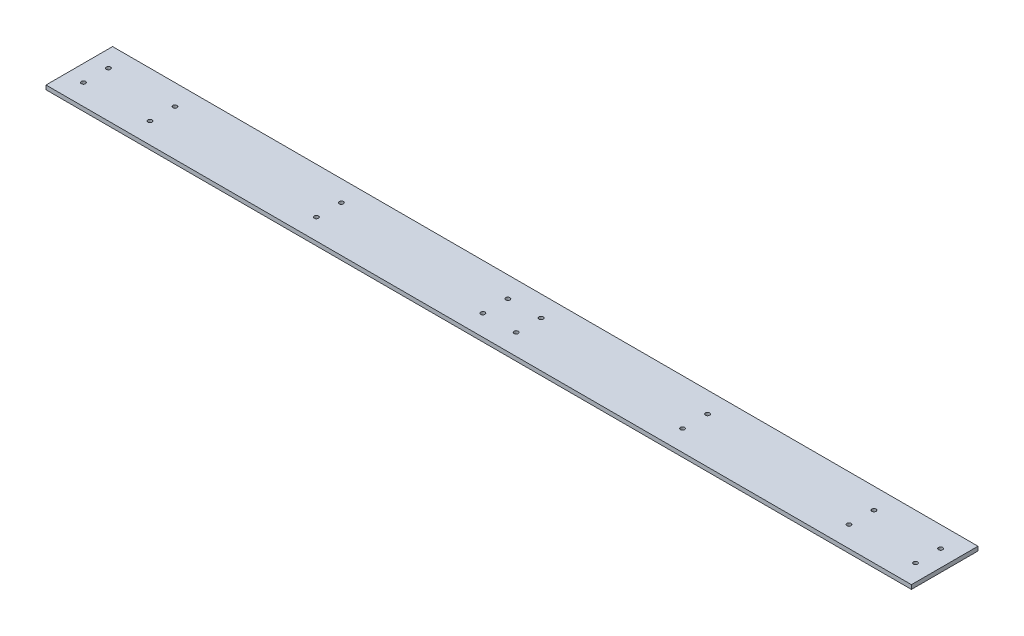
ISO-10303-21;
HEADER;
FILE_DESCRIPTION(('STEP AP214'),'2;1');
FILE_NAME('part.step','',(''),(''),'','','');
FILE_SCHEMA(('AUTOMOTIVE_DESIGN { 1 0 10303 214 1 1 1 1 }'));
ENDSEC;
DATA;
#1=APPLICATION_CONTEXT('core data for automotive mechanical design processes');
#2=APPLICATION_PROTOCOL_DEFINITION('international standard','automotive_design',2000,#1);
#3=PRODUCT_CONTEXT('',#1,'mechanical');
#4=PRODUCT('Part','Part','',(#3));
#5=PRODUCT_RELATED_PRODUCT_CATEGORY('part','',(#4));
#6=PRODUCT_DEFINITION_FORMATION('','',#4);
#7=PRODUCT_DEFINITION_CONTEXT('part definition',#1,'design');
#8=PRODUCT_DEFINITION('design','',#6,#7);
#9=PRODUCT_DEFINITION_SHAPE('','',#8);
#10=(LENGTH_UNIT() NAMED_UNIT(*) SI_UNIT(.MILLI.,.METRE.));
#11=(NAMED_UNIT(*) PLANE_ANGLE_UNIT() SI_UNIT($,.RADIAN.));
#12=(NAMED_UNIT(*) SI_UNIT($,.STERADIAN.) SOLID_ANGLE_UNIT());
#13=UNCERTAINTY_MEASURE_WITH_UNIT(LENGTH_MEASURE(1.E-05),#10,'distance_accuracy_value','');
#14=(GEOMETRIC_REPRESENTATION_CONTEXT(3) GLOBAL_UNCERTAINTY_ASSIGNED_CONTEXT((#13)) GLOBAL_UNIT_ASSIGNED_CONTEXT((#10,
#11,#12)) REPRESENTATION_CONTEXT('',''));
#15=CARTESIAN_POINT('',(0.,0.,0.));
#16=DIRECTION('',(0.,0.,1.));
#17=DIRECTION('',(1.,0.,0.));
#18=AXIS2_PLACEMENT_3D('',#15,#16,#17);
#19=CARTESIAN_POINT('',(0.,5.,0.));
#20=DIRECTION('',(0.,1.,0.));
#21=DIRECTION('',(0.,0.,1.));
#22=AXIS2_PLACEMENT_3D('',#19,#20,#21);
#23=PLANE('',#22);
#24=CARTESIAN_POINT('',(-480.,5.,-15.));
#25=DIRECTION('',(0.,1.,0.));
#26=DIRECTION('',(0.,0.,1.));
#27=AXIS2_PLACEMENT_3D('',#24,#25,#26);
#28=CIRCLE('',#27,2.50000000000002);
#29=CARTESIAN_POINT('',(-480.,5.,-12.5));
#30=VERTEX_POINT('',#29);
#31=EDGE_CURVE('E195',#30,#30,#28,.T.);
#32=ORIENTED_EDGE('',*,*,#31,.F.);
#33=EDGE_LOOP('',(#32));
#34=FACE_BOUND('',#33,.T.);
#35=CARTESIAN_POINT('',(520.,5.,-15.));
#36=DIRECTION('',(0.,1.,0.));
#37=DIRECTION('',(0.,0.,1.));
#38=AXIS2_PLACEMENT_3D('',#35,#36,#37);
#39=CIRCLE('',#38,2.49999999999991);
#40=CARTESIAN_POINT('',(520.,5.,-12.5000000000001));
#41=VERTEX_POINT('',#40);
#42=EDGE_CURVE('E183',#41,#41,#39,.T.);
#43=ORIENTED_EDGE('',*,*,#42,.F.);
#44=EDGE_LOOP('',(#43));
#45=FACE_BOUND('',#44,.T.);
#46=CARTESIAN_POINT('',(440.,5.,-15.));
#47=DIRECTION('',(0.,1.,0.));
#48=DIRECTION('',(0.,0.,1.));
#49=AXIS2_PLACEMENT_3D('',#46,#47,#48);
#50=CIRCLE('',#49,2.50000000000002);
#51=CARTESIAN_POINT('',(440.,5.,-12.5));
#52=VERTEX_POINT('',#51);
#53=EDGE_CURVE('E171',#52,#52,#50,.T.);
#54=ORIENTED_EDGE('',*,*,#53,.F.);
#55=EDGE_LOOP('',(#54));
#56=FACE_BOUND('',#55,.T.);
#57=CARTESIAN_POINT('',(-400.,5.,-14.9999999999917));
#58=DIRECTION('',(0.,1.,0.));
#59=DIRECTION('',(0.,0.,1.));
#60=AXIS2_PLACEMENT_3D('',#57,#58,#59);
#61=CIRCLE('',#60,2.50000000000002);
#62=CARTESIAN_POINT('',(-400.,5.,-12.4999999999917));
#63=VERTEX_POINT('',#62);
#64=EDGE_CURVE('E159',#63,#63,#61,.T.);
#65=ORIENTED_EDGE('',*,*,#64,.F.);
#66=EDGE_LOOP('',(#65));
#67=FACE_BOUND('',#66,.T.);
#68=CARTESIAN_POINT('',(240.,5.,-15.));
#69=DIRECTION('',(0.,1.,0.));
#70=DIRECTION('',(0.,0.,1.));
#71=AXIS2_PLACEMENT_3D('',#68,#69,#70);
#72=CIRCLE('',#71,2.5);
#73=CARTESIAN_POINT('',(240.,5.,-12.5));
#74=VERTEX_POINT('',#73);
#75=EDGE_CURVE('E147',#74,#74,#72,.T.);
#76=ORIENTED_EDGE('',*,*,#75,.F.);
#77=EDGE_LOOP('',(#76));
#78=FACE_BOUND('',#77,.T.);
#79=CARTESIAN_POINT('',(-200.,5.,-14.9999999999959));
#80=DIRECTION('',(0.,1.,0.));
#81=DIRECTION('',(0.,0.,1.));
#82=AXIS2_PLACEMENT_3D('',#79,#80,#81);
#83=CIRCLE('',#82,2.5);
#84=CARTESIAN_POINT('',(-200.,5.,-12.4999999999959));
#85=VERTEX_POINT('',#84);
#86=EDGE_CURVE('E135',#85,#85,#83,.T.);
#87=ORIENTED_EDGE('',*,*,#86,.F.);
#88=EDGE_LOOP('',(#87));
#89=FACE_BOUND('',#88,.T.);
#90=CARTESIAN_POINT('',(40.,5.,-15.));
#91=DIRECTION('',(0.,1.,0.));
#92=DIRECTION('',(0.,0.,1.));
#93=AXIS2_PLACEMENT_3D('',#90,#91,#92);
#94=CIRCLE('',#93,2.5);
#95=CARTESIAN_POINT('',(40.,5.,-12.5));
#96=VERTEX_POINT('',#95);
#97=EDGE_CURVE('E123',#96,#96,#94,.T.);
#98=ORIENTED_EDGE('',*,*,#97,.F.);
#99=EDGE_LOOP('',(#98));
#100=FACE_BOUND('',#99,.T.);
#101=CARTESIAN_POINT('',(0.,5.,-15.));
#102=DIRECTION('',(0.,1.,0.));
#103=DIRECTION('',(0.,0.,1.));
#104=AXIS2_PLACEMENT_3D('',#101,#102,#103);
#105=CIRCLE('',#104,2.5);
#106=CARTESIAN_POINT('',(0.,5.,-12.5));
#107=VERTEX_POINT('',#106);
#108=EDGE_CURVE('E102',#107,#107,#105,.T.);
#109=ORIENTED_EDGE('',*,*,#108,.F.);
#110=EDGE_LOOP('',(#109));
#111=FACE_BOUND('',#110,.T.);
#112=DIRECTION('',(0.,0.,1.));
#113=VECTOR('',#112,1.);
#114=CARTESIAN_POINT('',(-500.,5.,-40.));
#115=LINE('',#114,#113);
#116=CARTESIAN_POINT('',(-500.,5.,-40.));
#117=VERTEX_POINT('',#116);
#118=CARTESIAN_POINT('',(-500.,5.,40.));
#119=VERTEX_POINT('',#118);
#120=EDGE_CURVE('E87',#117,#119,#115,.T.);
#121=ORIENTED_EDGE('',*,*,#120,.T.);
#122=DIRECTION('',(1.,0.,0.));
#123=VECTOR('',#122,1.);
#124=CARTESIAN_POINT('',(-500.,5.,40.));
#125=LINE('',#124,#123);
#126=CARTESIAN_POINT('',(540.,5.,40.));
#127=VERTEX_POINT('',#126);
#128=EDGE_CURVE('E82',#119,#127,#125,.T.);
#129=ORIENTED_EDGE('',*,*,#128,.T.);
#130=DIRECTION('',(0.,0.,-1.));
#131=VECTOR('',#130,1.);
#132=CARTESIAN_POINT('',(540.,5.,-40.));
#133=LINE('',#132,#131);
#134=CARTESIAN_POINT('',(540.,5.,-40.));
#135=VERTEX_POINT('',#134);
#136=EDGE_CURVE('E85',#127,#135,#133,.T.);
#137=ORIENTED_EDGE('',*,*,#136,.T.);
#138=DIRECTION('',(-1.,0.,0.));
#139=VECTOR('',#138,1.);
#140=CARTESIAN_POINT('',(-500.,5.,-40.));
#141=LINE('',#140,#139);
#142=EDGE_CURVE('E52',#135,#117,#141,.T.);
#143=ORIENTED_EDGE('',*,*,#142,.T.);
#144=EDGE_LOOP('',(#121,#129,#137,#143));
#145=FACE_BOUND('',#144,.T.);
#146=CARTESIAN_POINT('',(0.,5.,15.));
#147=DIRECTION('',(0.,1.,0.));
#148=DIRECTION('',(0.,0.,1.));
#149=AXIS2_PLACEMENT_3D('',#146,#147,#148);
#150=CIRCLE('',#149,2.5);
#151=CARTESIAN_POINT('',(0.,5.,17.5));
#152=VERTEX_POINT('',#151);
#153=EDGE_CURVE('E117',#152,#152,#150,.T.);
#154=ORIENTED_EDGE('',*,*,#153,.F.);
#155=EDGE_LOOP('',(#154));
#156=FACE_BOUND('',#155,.T.);
#157=CARTESIAN_POINT('',(40.,5.,15.));
#158=DIRECTION('',(0.,1.,0.));
#159=DIRECTION('',(0.,0.,1.));
#160=AXIS2_PLACEMENT_3D('',#157,#158,#159);
#161=CIRCLE('',#160,2.5);
#162=CARTESIAN_POINT('',(40.,5.,17.5));
#163=VERTEX_POINT('',#162);
#164=EDGE_CURVE('E129',#163,#163,#161,.T.);
#165=ORIENTED_EDGE('',*,*,#164,.F.);
#166=EDGE_LOOP('',(#165));
#167=FACE_BOUND('',#166,.T.);
#168=CARTESIAN_POINT('',(-200.,5.,15.0000000000041));
#169=DIRECTION('',(0.,1.,0.));
#170=DIRECTION('',(0.,0.,1.));
#171=AXIS2_PLACEMENT_3D('',#168,#169,#170);
#172=CIRCLE('',#171,2.5);
#173=CARTESIAN_POINT('',(-200.,5.,17.5000000000041));
#174=VERTEX_POINT('',#173);
#175=EDGE_CURVE('E141',#174,#174,#172,.T.);
#176=ORIENTED_EDGE('',*,*,#175,.F.);
#177=EDGE_LOOP('',(#176));
#178=FACE_BOUND('',#177,.T.);
#179=CARTESIAN_POINT('',(240.,5.,15.));
#180=DIRECTION('',(0.,1.,0.));
#181=DIRECTION('',(0.,0.,1.));
#182=AXIS2_PLACEMENT_3D('',#179,#180,#181);
#183=CIRCLE('',#182,2.5);
#184=CARTESIAN_POINT('',(240.,5.,17.5));
#185=VERTEX_POINT('',#184);
#186=EDGE_CURVE('E153',#185,#185,#183,.T.);
#187=ORIENTED_EDGE('',*,*,#186,.F.);
#188=EDGE_LOOP('',(#187));
#189=FACE_BOUND('',#188,.T.);
#190=CARTESIAN_POINT('',(-400.,5.,15.0000000000083));
#191=DIRECTION('',(0.,1.,0.));
#192=DIRECTION('',(0.,0.,1.));
#193=AXIS2_PLACEMENT_3D('',#190,#191,#192);
#194=CIRCLE('',#193,2.50000000000002);
#195=CARTESIAN_POINT('',(-400.,5.,17.5000000000083));
#196=VERTEX_POINT('',#195);
#197=EDGE_CURVE('E165',#196,#196,#194,.T.);
#198=ORIENTED_EDGE('',*,*,#197,.F.);
#199=EDGE_LOOP('',(#198));
#200=FACE_BOUND('',#199,.T.);
#201=CARTESIAN_POINT('',(440.,5.,15.));
#202=DIRECTION('',(0.,1.,0.));
#203=DIRECTION('',(0.,0.,1.));
#204=AXIS2_PLACEMENT_3D('',#201,#202,#203);
#205=CIRCLE('',#204,2.50000000000002);
#206=CARTESIAN_POINT('',(440.,5.,17.5));
#207=VERTEX_POINT('',#206);
#208=EDGE_CURVE('E177',#207,#207,#205,.T.);
#209=ORIENTED_EDGE('',*,*,#208,.F.);
#210=EDGE_LOOP('',(#209));
#211=FACE_BOUND('',#210,.T.);
#212=CARTESIAN_POINT('',(520.,5.,15.));
#213=DIRECTION('',(0.,1.,0.));
#214=DIRECTION('',(0.,0.,1.));
#215=AXIS2_PLACEMENT_3D('',#212,#213,#214);
#216=CIRCLE('',#215,2.49999999999991);
#217=CARTESIAN_POINT('',(520.,5.,17.4999999999999));
#218=VERTEX_POINT('',#217);
#219=EDGE_CURVE('E189',#218,#218,#216,.T.);
#220=ORIENTED_EDGE('',*,*,#219,.F.);
#221=EDGE_LOOP('',(#220));
#222=FACE_BOUND('',#221,.T.);
#223=CARTESIAN_POINT('',(-480.,5.,15.));
#224=DIRECTION('',(0.,1.,0.));
#225=DIRECTION('',(0.,0.,1.));
#226=AXIS2_PLACEMENT_3D('',#223,#224,#225);
#227=CIRCLE('',#226,2.50000000000002);
#228=CARTESIAN_POINT('',(-480.,5.,17.5));
#229=VERTEX_POINT('',#228);
#230=EDGE_CURVE('E201',#229,#229,#227,.T.);
#231=ORIENTED_EDGE('',*,*,#230,.F.);
#232=EDGE_LOOP('',(#231));
#233=FACE_BOUND('',#232,.T.);
#234=ADVANCED_FACE('F35',(#34,#45,#56,#67,#78,#89,#100,#111,#145,#156,#167,#178,#189,#200,#211,
#222,#233),#23,.T.);
#235=CARTESIAN_POINT('',(0.,0.,0.));
#236=DIRECTION('',(0.,1.,0.));
#237=DIRECTION('',(0.,0.,1.));
#238=AXIS2_PLACEMENT_3D('',#235,#236,#237);
#239=PLANE('',#238);
#240=DIRECTION('',(0.,0.,1.));
#241=VECTOR('',#240,1.);
#242=CARTESIAN_POINT('',(-500.,0.,-40.));
#243=LINE('',#242,#241);
#244=CARTESIAN_POINT('',(-500.,0.,-40.));
#245=VERTEX_POINT('',#244);
#246=CARTESIAN_POINT('',(-500.,0.,40.));
#247=VERTEX_POINT('',#246);
#248=EDGE_CURVE('E99',#245,#247,#243,.T.);
#249=ORIENTED_EDGE('',*,*,#248,.F.);
#250=DIRECTION('',(-1.,0.,0.));
#251=VECTOR('',#250,1.);
#252=CARTESIAN_POINT('',(-500.,0.,-40.));
#253=LINE('',#252,#251);
#254=CARTESIAN_POINT('',(540.,0.,-40.));
#255=VERTEX_POINT('',#254);
#256=EDGE_CURVE('E75',#255,#245,#253,.T.);
#257=ORIENTED_EDGE('',*,*,#256,.F.);
#258=DIRECTION('',(0.,0.,-1.));
#259=VECTOR('',#258,1.);
#260=CARTESIAN_POINT('',(540.,0.,-40.));
#261=LINE('',#260,#259);
#262=CARTESIAN_POINT('',(540.,0.,40.));
#263=VERTEX_POINT('',#262);
#264=EDGE_CURVE('E69',#263,#255,#261,.T.);
#265=ORIENTED_EDGE('',*,*,#264,.F.);
#266=DIRECTION('',(1.,0.,0.));
#267=VECTOR('',#266,1.);
#268=CARTESIAN_POINT('',(-500.,0.,40.));
#269=LINE('',#268,#267);
#270=EDGE_CURVE('E91',#247,#263,#269,.T.);
#271=ORIENTED_EDGE('',*,*,#270,.F.);
#272=EDGE_LOOP('',(#249,#257,#265,#271));
#273=FACE_BOUND('',#272,.T.);
#274=CARTESIAN_POINT('',(0.,0.,-15.));
#275=DIRECTION('',(0.,1.,0.));
#276=DIRECTION('',(0.,0.,1.));
#277=AXIS2_PLACEMENT_3D('',#274,#275,#276);
#278=CIRCLE('',#277,2.5);
#279=CARTESIAN_POINT('',(0.,0.,-12.5));
#280=VERTEX_POINT('',#279);
#281=EDGE_CURVE('E114',#280,#280,#278,.T.);
#282=ORIENTED_EDGE('',*,*,#281,.T.);
#283=EDGE_LOOP('',(#282));
#284=FACE_BOUND('',#283,.T.);
#285=CARTESIAN_POINT('',(0.,0.,15.));
#286=DIRECTION('',(0.,1.,0.));
#287=DIRECTION('',(0.,0.,1.));
#288=AXIS2_PLACEMENT_3D('',#285,#286,#287);
#289=CIRCLE('',#288,2.5);
#290=CARTESIAN_POINT('',(0.,0.,17.5));
#291=VERTEX_POINT('',#290);
#292=EDGE_CURVE('E120',#291,#291,#289,.T.);
#293=ORIENTED_EDGE('',*,*,#292,.T.);
#294=EDGE_LOOP('',(#293));
#295=FACE_BOUND('',#294,.T.);
#296=CARTESIAN_POINT('',(40.,0.,-15.));
#297=DIRECTION('',(0.,1.,0.));
#298=DIRECTION('',(0.,0.,1.));
#299=AXIS2_PLACEMENT_3D('',#296,#297,#298);
#300=CIRCLE('',#299,2.5);
#301=CARTESIAN_POINT('',(40.,0.,-12.5));
#302=VERTEX_POINT('',#301);
#303=EDGE_CURVE('E126',#302,#302,#300,.T.);
#304=ORIENTED_EDGE('',*,*,#303,.T.);
#305=EDGE_LOOP('',(#304));
#306=FACE_BOUND('',#305,.T.);
#307=CARTESIAN_POINT('',(40.,0.,15.));
#308=DIRECTION('',(0.,1.,0.));
#309=DIRECTION('',(0.,0.,1.));
#310=AXIS2_PLACEMENT_3D('',#307,#308,#309);
#311=CIRCLE('',#310,2.5);
#312=CARTESIAN_POINT('',(40.,0.,17.5));
#313=VERTEX_POINT('',#312);
#314=EDGE_CURVE('E132',#313,#313,#311,.T.);
#315=ORIENTED_EDGE('',*,*,#314,.T.);
#316=EDGE_LOOP('',(#315));
#317=FACE_BOUND('',#316,.T.);
#318=CARTESIAN_POINT('',(-200.,0.,-14.9999999999959));
#319=DIRECTION('',(0.,1.,0.));
#320=DIRECTION('',(0.,0.,1.));
#321=AXIS2_PLACEMENT_3D('',#318,#319,#320);
#322=CIRCLE('',#321,2.5);
#323=CARTESIAN_POINT('',(-200.,0.,-12.4999999999959));
#324=VERTEX_POINT('',#323);
#325=EDGE_CURVE('E138',#324,#324,#322,.T.);
#326=ORIENTED_EDGE('',*,*,#325,.T.);
#327=EDGE_LOOP('',(#326));
#328=FACE_BOUND('',#327,.T.);
#329=CARTESIAN_POINT('',(-200.,0.,15.0000000000041));
#330=DIRECTION('',(0.,1.,0.));
#331=DIRECTION('',(0.,0.,1.));
#332=AXIS2_PLACEMENT_3D('',#329,#330,#331);
#333=CIRCLE('',#332,2.5);
#334=CARTESIAN_POINT('',(-200.,0.,17.5000000000041));
#335=VERTEX_POINT('',#334);
#336=EDGE_CURVE('E144',#335,#335,#333,.T.);
#337=ORIENTED_EDGE('',*,*,#336,.T.);
#338=EDGE_LOOP('',(#337));
#339=FACE_BOUND('',#338,.T.);
#340=CARTESIAN_POINT('',(240.,0.,-15.));
#341=DIRECTION('',(0.,1.,0.));
#342=DIRECTION('',(0.,0.,1.));
#343=AXIS2_PLACEMENT_3D('',#340,#341,#342);
#344=CIRCLE('',#343,2.5);
#345=CARTESIAN_POINT('',(240.,0.,-12.5));
#346=VERTEX_POINT('',#345);
#347=EDGE_CURVE('E150',#346,#346,#344,.T.);
#348=ORIENTED_EDGE('',*,*,#347,.T.);
#349=EDGE_LOOP('',(#348));
#350=FACE_BOUND('',#349,.T.);
#351=CARTESIAN_POINT('',(240.,0.,15.));
#352=DIRECTION('',(0.,1.,0.));
#353=DIRECTION('',(0.,0.,1.));
#354=AXIS2_PLACEMENT_3D('',#351,#352,#353);
#355=CIRCLE('',#354,2.5);
#356=CARTESIAN_POINT('',(240.,0.,17.5));
#357=VERTEX_POINT('',#356);
#358=EDGE_CURVE('E156',#357,#357,#355,.T.);
#359=ORIENTED_EDGE('',*,*,#358,.T.);
#360=EDGE_LOOP('',(#359));
#361=FACE_BOUND('',#360,.T.);
#362=CARTESIAN_POINT('',(-400.,0.,-14.9999999999917));
#363=DIRECTION('',(0.,1.,0.));
#364=DIRECTION('',(0.,0.,1.));
#365=AXIS2_PLACEMENT_3D('',#362,#363,#364);
#366=CIRCLE('',#365,2.50000000000002);
#367=CARTESIAN_POINT('',(-400.,0.,-12.4999999999917));
#368=VERTEX_POINT('',#367);
#369=EDGE_CURVE('E162',#368,#368,#366,.T.);
#370=ORIENTED_EDGE('',*,*,#369,.T.);
#371=EDGE_LOOP('',(#370));
#372=FACE_BOUND('',#371,.T.);
#373=CARTESIAN_POINT('',(-400.,0.,15.0000000000083));
#374=DIRECTION('',(0.,1.,0.));
#375=DIRECTION('',(0.,0.,1.));
#376=AXIS2_PLACEMENT_3D('',#373,#374,#375);
#377=CIRCLE('',#376,2.50000000000002);
#378=CARTESIAN_POINT('',(-400.,0.,17.5000000000083));
#379=VERTEX_POINT('',#378);
#380=EDGE_CURVE('E168',#379,#379,#377,.T.);
#381=ORIENTED_EDGE('',*,*,#380,.T.);
#382=EDGE_LOOP('',(#381));
#383=FACE_BOUND('',#382,.T.);
#384=CARTESIAN_POINT('',(440.,0.,-15.));
#385=DIRECTION('',(0.,1.,0.));
#386=DIRECTION('',(0.,0.,1.));
#387=AXIS2_PLACEMENT_3D('',#384,#385,#386);
#388=CIRCLE('',#387,2.50000000000002);
#389=CARTESIAN_POINT('',(440.,0.,-12.5));
#390=VERTEX_POINT('',#389);
#391=EDGE_CURVE('E174',#390,#390,#388,.T.);
#392=ORIENTED_EDGE('',*,*,#391,.T.);
#393=EDGE_LOOP('',(#392));
#394=FACE_BOUND('',#393,.T.);
#395=CARTESIAN_POINT('',(440.,0.,15.));
#396=DIRECTION('',(0.,1.,0.));
#397=DIRECTION('',(0.,0.,1.));
#398=AXIS2_PLACEMENT_3D('',#395,#396,#397);
#399=CIRCLE('',#398,2.50000000000002);
#400=CARTESIAN_POINT('',(440.,0.,17.5));
#401=VERTEX_POINT('',#400);
#402=EDGE_CURVE('E180',#401,#401,#399,.T.);
#403=ORIENTED_EDGE('',*,*,#402,.T.);
#404=EDGE_LOOP('',(#403));
#405=FACE_BOUND('',#404,.T.);
#406=CARTESIAN_POINT('',(520.,0.,-15.));
#407=DIRECTION('',(0.,1.,0.));
#408=DIRECTION('',(0.,0.,1.));
#409=AXIS2_PLACEMENT_3D('',#406,#407,#408);
#410=CIRCLE('',#409,2.49999999999991);
#411=CARTESIAN_POINT('',(520.,0.,-12.5000000000001));
#412=VERTEX_POINT('',#411);
#413=EDGE_CURVE('E186',#412,#412,#410,.T.);
#414=ORIENTED_EDGE('',*,*,#413,.T.);
#415=EDGE_LOOP('',(#414));
#416=FACE_BOUND('',#415,.T.);
#417=CARTESIAN_POINT('',(520.,0.,15.));
#418=DIRECTION('',(0.,1.,0.));
#419=DIRECTION('',(0.,0.,1.));
#420=AXIS2_PLACEMENT_3D('',#417,#418,#419);
#421=CIRCLE('',#420,2.49999999999991);
#422=CARTESIAN_POINT('',(520.,0.,17.4999999999999));
#423=VERTEX_POINT('',#422);
#424=EDGE_CURVE('E192',#423,#423,#421,.T.);
#425=ORIENTED_EDGE('',*,*,#424,.T.);
#426=EDGE_LOOP('',(#425));
#427=FACE_BOUND('',#426,.T.);
#428=CARTESIAN_POINT('',(-480.,0.,-15.));
#429=DIRECTION('',(0.,1.,0.));
#430=DIRECTION('',(0.,0.,1.));
#431=AXIS2_PLACEMENT_3D('',#428,#429,#430);
#432=CIRCLE('',#431,2.50000000000002);
#433=CARTESIAN_POINT('',(-480.,0.,-12.5));
#434=VERTEX_POINT('',#433);
#435=EDGE_CURVE('E198',#434,#434,#432,.T.);
#436=ORIENTED_EDGE('',*,*,#435,.T.);
#437=EDGE_LOOP('',(#436));
#438=FACE_BOUND('',#437,.T.);
#439=CARTESIAN_POINT('',(-480.,0.,15.));
#440=DIRECTION('',(0.,1.,0.));
#441=DIRECTION('',(0.,0.,1.));
#442=AXIS2_PLACEMENT_3D('',#439,#440,#441);
#443=CIRCLE('',#442,2.50000000000002);
#444=CARTESIAN_POINT('',(-480.,0.,17.5));
#445=VERTEX_POINT('',#444);
#446=EDGE_CURVE('E204',#445,#445,#443,.T.);
#447=ORIENTED_EDGE('',*,*,#446,.T.);
#448=EDGE_LOOP('',(#447));
#449=FACE_BOUND('',#448,.T.);
#450=ADVANCED_FACE('F110',(#273,#284,#295,#306,#317,#328,#339,#350,#361,#372,#383,#394,#405,
#416,#427,#438,#449),#239,.F.);
#451=CARTESIAN_POINT('',(-500.,5.,-40.));
#452=DIRECTION('',(1.,0.,0.));
#453=DIRECTION('',(0.,0.,-1.));
#454=AXIS2_PLACEMENT_3D('',#451,#452,#453);
#455=PLANE('',#454);
#456=ORIENTED_EDGE('',*,*,#248,.T.);
#457=DIRECTION('',(0.,-1.,0.));
#458=VECTOR('',#457,1.);
#459=CARTESIAN_POINT('',(-500.,5.,40.));
#460=LINE('',#459,#458);
#461=EDGE_CURVE('E11',#119,#247,#460,.T.);
#462=ORIENTED_EDGE('',*,*,#461,.F.);
#463=ORIENTED_EDGE('',*,*,#120,.F.);
#464=DIRECTION('',(0.,-1.,0.));
#465=VECTOR('',#464,1.);
#466=CARTESIAN_POINT('',(-500.,5.,-40.));
#467=LINE('',#466,#465);
#468=EDGE_CURVE('E95',#117,#245,#467,.T.);
#469=ORIENTED_EDGE('',*,*,#468,.T.);
#470=EDGE_LOOP('',(#456,#462,#463,#469));
#471=FACE_BOUND('',#470,.T.);
#472=ADVANCED_FACE('F37',(#471),#455,.F.);
#473=CARTESIAN_POINT('',(-500.,5.,40.));
#474=DIRECTION('',(0.,0.,-1.));
#475=DIRECTION('',(-1.,0.,0.));
#476=AXIS2_PLACEMENT_3D('',#473,#474,#475);
#477=PLANE('',#476);
#478=ORIENTED_EDGE('',*,*,#270,.T.);
#479=DIRECTION('',(0.,-1.,0.));
#480=VECTOR('',#479,1.);
#481=CARTESIAN_POINT('',(540.,5.,40.));
#482=LINE('',#481,#480);
#483=EDGE_CURVE('E44',#127,#263,#482,.T.);
#484=ORIENTED_EDGE('',*,*,#483,.F.);
#485=ORIENTED_EDGE('',*,*,#128,.F.);
#486=ORIENTED_EDGE('',*,*,#461,.T.);
#487=EDGE_LOOP('',(#478,#484,#485,#486));
#488=FACE_BOUND('',#487,.T.);
#489=ADVANCED_FACE('F90',(#488),#477,.F.);
#490=CARTESIAN_POINT('',(540.,5.,-40.));
#491=DIRECTION('',(-1.,0.,0.));
#492=DIRECTION('',(0.,0.,1.));
#493=AXIS2_PLACEMENT_3D('',#490,#491,#492);
#494=PLANE('',#493);
#495=ORIENTED_EDGE('',*,*,#264,.T.);
#496=DIRECTION('',(0.,-1.,0.));
#497=VECTOR('',#496,1.);
#498=CARTESIAN_POINT('',(540.,5.,-40.));
#499=LINE('',#498,#497);
#500=EDGE_CURVE('E92',#135,#255,#499,.T.);
#501=ORIENTED_EDGE('',*,*,#500,.F.);
#502=ORIENTED_EDGE('',*,*,#136,.F.);
#503=ORIENTED_EDGE('',*,*,#483,.T.);
#504=EDGE_LOOP('',(#495,#501,#502,#503));
#505=FACE_BOUND('',#504,.T.);
#506=ADVANCED_FACE('F93',(#505),#494,.F.);
#507=CARTESIAN_POINT('',(-500.,5.,-40.));
#508=DIRECTION('',(0.,0.,1.));
#509=DIRECTION('',(1.,0.,0.));
#510=AXIS2_PLACEMENT_3D('',#507,#508,#509);
#511=PLANE('',#510);
#512=ORIENTED_EDGE('',*,*,#256,.T.);
#513=ORIENTED_EDGE('',*,*,#468,.F.);
#514=ORIENTED_EDGE('',*,*,#142,.F.);
#515=ORIENTED_EDGE('',*,*,#500,.T.);
#516=EDGE_LOOP('',(#512,#513,#514,#515));
#517=FACE_BOUND('',#516,.T.);
#518=ADVANCED_FACE('F107',(#517),#511,.F.);
#519=CARTESIAN_POINT('',(0.,5.,-15.));
#520=DIRECTION('',(0.,-1.,0.));
#521=DIRECTION('',(0.,0.,-1.));
#522=AXIS2_PLACEMENT_3D('',#519,#520,#521);
#523=CYLINDRICAL_SURFACE('',#522,2.5);
#524=ORIENTED_EDGE('',*,*,#108,.T.);
#525=EDGE_LOOP('',(#524));
#526=FACE_BOUND('',#525,.T.);
#527=ORIENTED_EDGE('',*,*,#281,.F.);
#528=EDGE_LOOP('',(#527));
#529=FACE_BOUND('',#528,.T.);
#530=ADVANCED_FACE('F223',(#526,#529),#523,.F.);
#531=CARTESIAN_POINT('',(0.,5.,15.));
#532=DIRECTION('',(0.,-1.,0.));
#533=DIRECTION('',(0.,0.,-1.));
#534=AXIS2_PLACEMENT_3D('',#531,#532,#533);
#535=CYLINDRICAL_SURFACE('',#534,2.5);
#536=ORIENTED_EDGE('',*,*,#153,.T.);
#537=EDGE_LOOP('',(#536));
#538=FACE_BOUND('',#537,.T.);
#539=ORIENTED_EDGE('',*,*,#292,.F.);
#540=EDGE_LOOP('',(#539));
#541=FACE_BOUND('',#540,.T.);
#542=ADVANCED_FACE('F269',(#538,#541),#535,.F.);
#543=CARTESIAN_POINT('',(40.,5.,-15.));
#544=DIRECTION('',(0.,-1.,0.));
#545=DIRECTION('',(0.,0.,-1.));
#546=AXIS2_PLACEMENT_3D('',#543,#544,#545);
#547=CYLINDRICAL_SURFACE('',#546,2.5);
#548=ORIENTED_EDGE('',*,*,#97,.T.);
#549=EDGE_LOOP('',(#548));
#550=FACE_BOUND('',#549,.T.);
#551=ORIENTED_EDGE('',*,*,#303,.F.);
#552=EDGE_LOOP('',(#551));
#553=FACE_BOUND('',#552,.T.);
#554=ADVANCED_FACE('F277',(#550,#553),#547,.F.);
#555=CARTESIAN_POINT('',(40.,5.,15.));
#556=DIRECTION('',(0.,-1.,0.));
#557=DIRECTION('',(0.,0.,-1.));
#558=AXIS2_PLACEMENT_3D('',#555,#556,#557);
#559=CYLINDRICAL_SURFACE('',#558,2.5);
#560=ORIENTED_EDGE('',*,*,#164,.T.);
#561=EDGE_LOOP('',(#560));
#562=FACE_BOUND('',#561,.T.);
#563=ORIENTED_EDGE('',*,*,#314,.F.);
#564=EDGE_LOOP('',(#563));
#565=FACE_BOUND('',#564,.T.);
#566=ADVANCED_FACE('F285',(#562,#565),#559,.F.);
#567=CARTESIAN_POINT('',(-200.,5.,-14.9999999999959));
#568=DIRECTION('',(0.,-1.,0.));
#569=DIRECTION('',(0.,0.,-1.));
#570=AXIS2_PLACEMENT_3D('',#567,#568,#569);
#571=CYLINDRICAL_SURFACE('',#570,2.5);
#572=ORIENTED_EDGE('',*,*,#86,.T.);
#573=EDGE_LOOP('',(#572));
#574=FACE_BOUND('',#573,.T.);
#575=ORIENTED_EDGE('',*,*,#325,.F.);
#576=EDGE_LOOP('',(#575));
#577=FACE_BOUND('',#576,.T.);
#578=ADVANCED_FACE('F294',(#574,#577),#571,.F.);
#579=CARTESIAN_POINT('',(-200.,5.,15.0000000000041));
#580=DIRECTION('',(0.,-1.,0.));
#581=DIRECTION('',(0.,0.,-1.));
#582=AXIS2_PLACEMENT_3D('',#579,#580,#581);
#583=CYLINDRICAL_SURFACE('',#582,2.5);
#584=ORIENTED_EDGE('',*,*,#175,.T.);
#585=EDGE_LOOP('',(#584));
#586=FACE_BOUND('',#585,.T.);
#587=ORIENTED_EDGE('',*,*,#336,.F.);
#588=EDGE_LOOP('',(#587));
#589=FACE_BOUND('',#588,.T.);
#590=ADVANCED_FACE('F303',(#586,#589),#583,.F.);
#591=CARTESIAN_POINT('',(240.,5.,-15.));
#592=DIRECTION('',(0.,-1.,0.));
#593=DIRECTION('',(0.,0.,-1.));
#594=AXIS2_PLACEMENT_3D('',#591,#592,#593);
#595=CYLINDRICAL_SURFACE('',#594,2.5);
#596=ORIENTED_EDGE('',*,*,#75,.T.);
#597=EDGE_LOOP('',(#596));
#598=FACE_BOUND('',#597,.T.);
#599=ORIENTED_EDGE('',*,*,#347,.F.);
#600=EDGE_LOOP('',(#599));
#601=FACE_BOUND('',#600,.T.);
#602=ADVANCED_FACE('F312',(#598,#601),#595,.F.);
#603=CARTESIAN_POINT('',(240.,5.,15.));
#604=DIRECTION('',(0.,-1.,0.));
#605=DIRECTION('',(0.,0.,-1.));
#606=AXIS2_PLACEMENT_3D('',#603,#604,#605);
#607=CYLINDRICAL_SURFACE('',#606,2.5);
#608=ORIENTED_EDGE('',*,*,#186,.T.);
#609=EDGE_LOOP('',(#608));
#610=FACE_BOUND('',#609,.T.);
#611=ORIENTED_EDGE('',*,*,#358,.F.);
#612=EDGE_LOOP('',(#611));
#613=FACE_BOUND('',#612,.T.);
#614=ADVANCED_FACE('F321',(#610,#613),#607,.F.);
#615=CARTESIAN_POINT('',(-400.,5.,-14.9999999999917));
#616=DIRECTION('',(0.,-1.,0.));
#617=DIRECTION('',(0.,0.,-1.));
#618=AXIS2_PLACEMENT_3D('',#615,#616,#617);
#619=CYLINDRICAL_SURFACE('',#618,2.50000000000002);
#620=ORIENTED_EDGE('',*,*,#64,.T.);
#621=EDGE_LOOP('',(#620));
#622=FACE_BOUND('',#621,.T.);
#623=ORIENTED_EDGE('',*,*,#369,.F.);
#624=EDGE_LOOP('',(#623));
#625=FACE_BOUND('',#624,.T.);
#626=ADVANCED_FACE('F330',(#622,#625),#619,.F.);
#627=CARTESIAN_POINT('',(-400.,5.,15.0000000000083));
#628=DIRECTION('',(0.,-1.,0.));
#629=DIRECTION('',(0.,0.,-1.));
#630=AXIS2_PLACEMENT_3D('',#627,#628,#629);
#631=CYLINDRICAL_SURFACE('',#630,2.50000000000002);
#632=ORIENTED_EDGE('',*,*,#197,.T.);
#633=EDGE_LOOP('',(#632));
#634=FACE_BOUND('',#633,.T.);
#635=ORIENTED_EDGE('',*,*,#380,.F.);
#636=EDGE_LOOP('',(#635));
#637=FACE_BOUND('',#636,.T.);
#638=ADVANCED_FACE('F339',(#634,#637),#631,.F.);
#639=CARTESIAN_POINT('',(440.,5.,-15.));
#640=DIRECTION('',(0.,-1.,0.));
#641=DIRECTION('',(0.,0.,-1.));
#642=AXIS2_PLACEMENT_3D('',#639,#640,#641);
#643=CYLINDRICAL_SURFACE('',#642,2.50000000000002);
#644=ORIENTED_EDGE('',*,*,#53,.T.);
#645=EDGE_LOOP('',(#644));
#646=FACE_BOUND('',#645,.T.);
#647=ORIENTED_EDGE('',*,*,#391,.F.);
#648=EDGE_LOOP('',(#647));
#649=FACE_BOUND('',#648,.T.);
#650=ADVANCED_FACE('F348',(#646,#649),#643,.F.);
#651=CARTESIAN_POINT('',(440.,5.,15.));
#652=DIRECTION('',(0.,-1.,0.));
#653=DIRECTION('',(0.,0.,-1.));
#654=AXIS2_PLACEMENT_3D('',#651,#652,#653);
#655=CYLINDRICAL_SURFACE('',#654,2.50000000000002);
#656=ORIENTED_EDGE('',*,*,#208,.T.);
#657=EDGE_LOOP('',(#656));
#658=FACE_BOUND('',#657,.T.);
#659=ORIENTED_EDGE('',*,*,#402,.F.);
#660=EDGE_LOOP('',(#659));
#661=FACE_BOUND('',#660,.T.);
#662=ADVANCED_FACE('F357',(#658,#661),#655,.F.);
#663=CARTESIAN_POINT('',(520.,5.,-15.));
#664=DIRECTION('',(0.,-1.,0.));
#665=DIRECTION('',(0.,0.,-1.));
#666=AXIS2_PLACEMENT_3D('',#663,#664,#665);
#667=CYLINDRICAL_SURFACE('',#666,2.49999999999991);
#668=ORIENTED_EDGE('',*,*,#42,.T.);
#669=EDGE_LOOP('',(#668));
#670=FACE_BOUND('',#669,.T.);
#671=ORIENTED_EDGE('',*,*,#413,.F.);
#672=EDGE_LOOP('',(#671));
#673=FACE_BOUND('',#672,.T.);
#674=ADVANCED_FACE('F366',(#670,#673),#667,.F.);
#675=CARTESIAN_POINT('',(520.,5.,15.));
#676=DIRECTION('',(0.,-1.,0.));
#677=DIRECTION('',(0.,0.,-1.));
#678=AXIS2_PLACEMENT_3D('',#675,#676,#677);
#679=CYLINDRICAL_SURFACE('',#678,2.49999999999991);
#680=ORIENTED_EDGE('',*,*,#219,.T.);
#681=EDGE_LOOP('',(#680));
#682=FACE_BOUND('',#681,.T.);
#683=ORIENTED_EDGE('',*,*,#424,.F.);
#684=EDGE_LOOP('',(#683));
#685=FACE_BOUND('',#684,.T.);
#686=ADVANCED_FACE('F375',(#682,#685),#679,.F.);
#687=CARTESIAN_POINT('',(-480.,5.,-15.));
#688=DIRECTION('',(0.,-1.,0.));
#689=DIRECTION('',(0.,0.,-1.));
#690=AXIS2_PLACEMENT_3D('',#687,#688,#689);
#691=CYLINDRICAL_SURFACE('',#690,2.50000000000002);
#692=ORIENTED_EDGE('',*,*,#31,.T.);
#693=EDGE_LOOP('',(#692));
#694=FACE_BOUND('',#693,.T.);
#695=ORIENTED_EDGE('',*,*,#435,.F.);
#696=EDGE_LOOP('',(#695));
#697=FACE_BOUND('',#696,.T.);
#698=ADVANCED_FACE('F384',(#694,#697),#691,.F.);
#699=CARTESIAN_POINT('',(-480.,5.,15.));
#700=DIRECTION('',(0.,-1.,0.));
#701=DIRECTION('',(0.,0.,-1.));
#702=AXIS2_PLACEMENT_3D('',#699,#700,#701);
#703=CYLINDRICAL_SURFACE('',#702,2.50000000000002);
#704=ORIENTED_EDGE('',*,*,#230,.T.);
#705=EDGE_LOOP('',(#704));
#706=FACE_BOUND('',#705,.T.);
#707=ORIENTED_EDGE('',*,*,#446,.F.);
#708=EDGE_LOOP('',(#707));
#709=FACE_BOUND('',#708,.T.);
#710=ADVANCED_FACE('F210',(#706,#709),#703,.F.);
#711=CLOSED_SHELL('',(#234,#450,#472,#489,#506,#518,#530,#542,#554,#566,#578,#590,#602,#614,
#626,#638,#650,#662,#674,#686,#698,#710));
#712=MANIFOLD_SOLID_BREP('B2',#711);
#713=ADVANCED_BREP_SHAPE_REPRESENTATION('',(#18,#712),#14);
#714=SHAPE_DEFINITION_REPRESENTATION(#9,#713);
ENDSEC;
END-ISO-10303-21;
